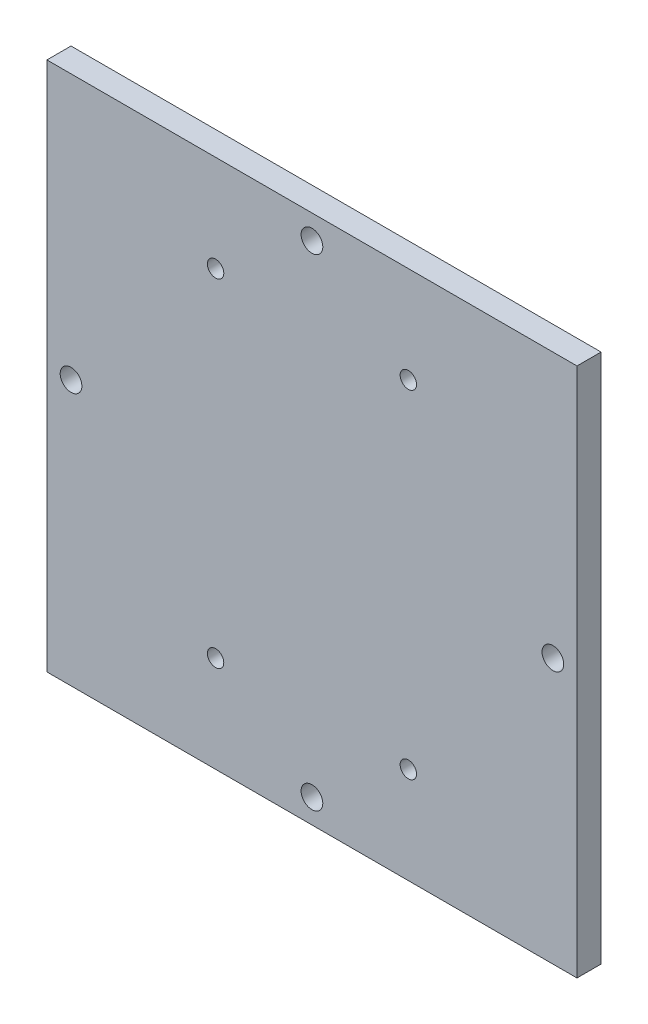
ISO-10303-21;
HEADER;
FILE_DESCRIPTION(('STEP AP214'),'2;1');
FILE_NAME('part.step','',(''),(''),'','','');
FILE_SCHEMA(('AUTOMOTIVE_DESIGN { 1 0 10303 214 1 1 1 1 }'));
ENDSEC;
DATA;
#1=APPLICATION_CONTEXT('core data for automotive mechanical design processes');
#2=APPLICATION_PROTOCOL_DEFINITION('international standard','automotive_design',2000,#1);
#3=PRODUCT_CONTEXT('',#1,'mechanical');
#4=PRODUCT('Part','Part','',(#3));
#5=PRODUCT_RELATED_PRODUCT_CATEGORY('part','',(#4));
#6=PRODUCT_DEFINITION_FORMATION('','',#4);
#7=PRODUCT_DEFINITION_CONTEXT('part definition',#1,'design');
#8=PRODUCT_DEFINITION('design','',#6,#7);
#9=PRODUCT_DEFINITION_SHAPE('','',#8);
#10=(LENGTH_UNIT() NAMED_UNIT(*) SI_UNIT(.MILLI.,.METRE.));
#11=(NAMED_UNIT(*) PLANE_ANGLE_UNIT() SI_UNIT($,.RADIAN.));
#12=(NAMED_UNIT(*) SI_UNIT($,.STERADIAN.) SOLID_ANGLE_UNIT());
#13=UNCERTAINTY_MEASURE_WITH_UNIT(LENGTH_MEASURE(1.E-05),#10,'distance_accuracy_value','');
#14=(GEOMETRIC_REPRESENTATION_CONTEXT(3) GLOBAL_UNCERTAINTY_ASSIGNED_CONTEXT((#13)) GLOBAL_UNIT_ASSIGNED_CONTEXT((#10,
#11,#12)) REPRESENTATION_CONTEXT('',''));
#15=CARTESIAN_POINT('',(0.,0.,0.));
#16=DIRECTION('',(0.,0.,1.));
#17=DIRECTION('',(1.,0.,0.));
#18=AXIS2_PLACEMENT_3D('',#15,#16,#17);
#19=CARTESIAN_POINT('',(110.,-110.,10.));
#20=DIRECTION('',(-1.,0.,0.));
#21=DIRECTION('',(0.,0.,1.));
#22=AXIS2_PLACEMENT_3D('',#19,#20,#21);
#23=PLANE('',#22);
#24=DIRECTION('',(0.,1.,0.));
#25=VECTOR('',#24,1.);
#26=CARTESIAN_POINT('',(110.,-110.,0.));
#27=LINE('',#26,#25);
#28=CARTESIAN_POINT('',(110.,-110.,0.));
#29=VERTEX_POINT('',#28);
#30=CARTESIAN_POINT('',(110.,110.,0.));
#31=VERTEX_POINT('',#30);
#32=EDGE_CURVE('E101',#29,#31,#27,.T.);
#33=ORIENTED_EDGE('',*,*,#32,.T.);
#34=DIRECTION('',(0.,0.,-1.));
#35=VECTOR('',#34,1.);
#36=CARTESIAN_POINT('',(110.,110.,10.));
#37=LINE('',#36,#35);
#38=CARTESIAN_POINT('',(110.,110.,10.));
#39=VERTEX_POINT('',#38);
#40=EDGE_CURVE('E11',#39,#31,#37,.T.);
#41=ORIENTED_EDGE('',*,*,#40,.F.);
#42=DIRECTION('',(0.,1.,0.));
#43=VECTOR('',#42,1.);
#44=CARTESIAN_POINT('',(110.,-110.,10.));
#45=LINE('',#44,#43);
#46=CARTESIAN_POINT('',(110.,-110.,10.));
#47=VERTEX_POINT('',#46);
#48=EDGE_CURVE('E89',#47,#39,#45,.T.);
#49=ORIENTED_EDGE('',*,*,#48,.F.);
#50=DIRECTION('',(0.,0.,-1.));
#51=VECTOR('',#50,1.);
#52=CARTESIAN_POINT('',(110.,-110.,10.));
#53=LINE('',#52,#51);
#54=EDGE_CURVE('E97',#47,#29,#53,.T.);
#55=ORIENTED_EDGE('',*,*,#54,.T.);
#56=EDGE_LOOP('',(#33,#41,#49,#55));
#57=FACE_BOUND('',#56,.T.);
#58=ADVANCED_FACE('F38',(#57),#23,.F.);
#59=CARTESIAN_POINT('',(-110.,110.,10.));
#60=DIRECTION('',(0.,-1.,0.));
#61=DIRECTION('',(0.,0.,-1.));
#62=AXIS2_PLACEMENT_3D('',#59,#60,#61);
#63=PLANE('',#62);
#64=DIRECTION('',(-1.,0.,0.));
#65=VECTOR('',#64,1.);
#66=CARTESIAN_POINT('',(-110.,110.,0.));
#67=LINE('',#66,#65);
#68=CARTESIAN_POINT('',(-110.,110.,0.));
#69=VERTEX_POINT('',#68);
#70=EDGE_CURVE('E93',#31,#69,#67,.T.);
#71=ORIENTED_EDGE('',*,*,#70,.T.);
#72=DIRECTION('',(0.,0.,-1.));
#73=VECTOR('',#72,1.);
#74=CARTESIAN_POINT('',(-110.,110.,10.));
#75=LINE('',#74,#73);
#76=CARTESIAN_POINT('',(-110.,110.,10.));
#77=VERTEX_POINT('',#76);
#78=EDGE_CURVE('E46',#77,#69,#75,.T.);
#79=ORIENTED_EDGE('',*,*,#78,.F.);
#80=DIRECTION('',(-1.,0.,0.));
#81=VECTOR('',#80,1.);
#82=CARTESIAN_POINT('',(-110.,110.,10.));
#83=LINE('',#82,#81);
#84=EDGE_CURVE('E84',#39,#77,#83,.T.);
#85=ORIENTED_EDGE('',*,*,#84,.F.);
#86=ORIENTED_EDGE('',*,*,#40,.T.);
#87=EDGE_LOOP('',(#71,#79,#85,#86));
#88=FACE_BOUND('',#87,.T.);
#89=ADVANCED_FACE('F92',(#88),#63,.F.);
#90=CARTESIAN_POINT('',(-110.,-110.,10.));
#91=DIRECTION('',(1.,0.,0.));
#92=DIRECTION('',(0.,0.,-1.));
#93=AXIS2_PLACEMENT_3D('',#90,#91,#92);
#94=PLANE('',#93);
#95=DIRECTION('',(0.,-1.,0.));
#96=VECTOR('',#95,1.);
#97=CARTESIAN_POINT('',(-110.,-110.,0.));
#98=LINE('',#97,#96);
#99=CARTESIAN_POINT('',(-110.,-110.,0.));
#100=VERTEX_POINT('',#99);
#101=EDGE_CURVE('E71',#69,#100,#98,.T.);
#102=ORIENTED_EDGE('',*,*,#101,.T.);
#103=DIRECTION('',(0.,0.,-1.));
#104=VECTOR('',#103,1.);
#105=CARTESIAN_POINT('',(-110.,-110.,10.));
#106=LINE('',#105,#104);
#107=CARTESIAN_POINT('',(-110.,-110.,10.));
#108=VERTEX_POINT('',#107);
#109=EDGE_CURVE('E94',#108,#100,#106,.T.);
#110=ORIENTED_EDGE('',*,*,#109,.F.);
#111=DIRECTION('',(0.,-1.,0.));
#112=VECTOR('',#111,1.);
#113=CARTESIAN_POINT('',(-110.,-110.,10.));
#114=LINE('',#113,#112);
#115=EDGE_CURVE('E87',#77,#108,#114,.T.);
#116=ORIENTED_EDGE('',*,*,#115,.F.);
#117=ORIENTED_EDGE('',*,*,#78,.T.);
#118=EDGE_LOOP('',(#102,#110,#116,#117));
#119=FACE_BOUND('',#118,.T.);
#120=ADVANCED_FACE('F95',(#119),#94,.F.);
#121=CARTESIAN_POINT('',(-110.,-110.,10.));
#122=DIRECTION('',(0.,1.,0.));
#123=DIRECTION('',(0.,0.,1.));
#124=AXIS2_PLACEMENT_3D('',#121,#122,#123);
#125=PLANE('',#124);
#126=DIRECTION('',(1.,0.,0.));
#127=VECTOR('',#126,1.);
#128=CARTESIAN_POINT('',(-110.,-110.,0.));
#129=LINE('',#128,#127);
#130=EDGE_CURVE('E77',#100,#29,#129,.T.);
#131=ORIENTED_EDGE('',*,*,#130,.T.);
#132=ORIENTED_EDGE('',*,*,#54,.F.);
#133=DIRECTION('',(1.,0.,0.));
#134=VECTOR('',#133,1.);
#135=CARTESIAN_POINT('',(-110.,-110.,10.));
#136=LINE('',#135,#134);
#137=EDGE_CURVE('E54',#108,#47,#136,.T.);
#138=ORIENTED_EDGE('',*,*,#137,.F.);
#139=ORIENTED_EDGE('',*,*,#109,.T.);
#140=EDGE_LOOP('',(#131,#132,#138,#139));
#141=FACE_BOUND('',#140,.T.);
#142=ADVANCED_FACE('F109',(#141),#125,.F.);
#143=CARTESIAN_POINT('',(0.,0.,10.));
#144=DIRECTION('',(0.,0.,-1.));
#145=DIRECTION('',(-1.,0.,0.));
#146=AXIS2_PLACEMENT_3D('',#143,#144,#145);
#147=PLANE('',#146);
#148=CARTESIAN_POINT('',(-40.,-70.,10.));
#149=DIRECTION('',(0.,0.,1.));
#150=DIRECTION('',(1.,0.,0.));
#151=AXIS2_PLACEMENT_3D('',#148,#149,#150);
#152=CIRCLE('',#151,3.4);
#153=CARTESIAN_POINT('',(-36.6,-70.,10.));
#154=VERTEX_POINT('',#153);
#155=EDGE_CURVE('E145',#154,#154,#152,.T.);
#156=ORIENTED_EDGE('',*,*,#155,.F.);
#157=EDGE_LOOP('',(#156));
#158=FACE_BOUND('',#157,.T.);
#159=CARTESIAN_POINT('',(40.,-70.,10.));
#160=DIRECTION('',(0.,0.,1.));
#161=DIRECTION('',(-1.,0.,0.));
#162=AXIS2_PLACEMENT_3D('',#159,#160,#161);
#163=CIRCLE('',#162,3.4);
#164=CARTESIAN_POINT('',(36.6,-70.,10.));
#165=VERTEX_POINT('',#164);
#166=EDGE_CURVE('E151',#165,#165,#163,.T.);
#167=ORIENTED_EDGE('',*,*,#166,.F.);
#168=EDGE_LOOP('',(#167));
#169=FACE_BOUND('',#168,.T.);
#170=CARTESIAN_POINT('',(40.,70.,10.));
#171=DIRECTION('',(0.,0.,1.));
#172=DIRECTION('',(1.,0.,0.));
#173=AXIS2_PLACEMENT_3D('',#170,#171,#172);
#174=CIRCLE('',#173,3.4);
#175=CARTESIAN_POINT('',(43.4,70.,10.));
#176=VERTEX_POINT('',#175);
#177=EDGE_CURVE('E157',#176,#176,#174,.T.);
#178=ORIENTED_EDGE('',*,*,#177,.F.);
#179=EDGE_LOOP('',(#178));
#180=FACE_BOUND('',#179,.T.);
#181=CARTESIAN_POINT('',(-40.,70.,10.));
#182=DIRECTION('',(0.,0.,1.));
#183=DIRECTION('',(-1.,0.,0.));
#184=AXIS2_PLACEMENT_3D('',#181,#182,#183);
#185=CIRCLE('',#184,3.4);
#186=CARTESIAN_POINT('',(-43.4,70.,10.));
#187=VERTEX_POINT('',#186);
#188=EDGE_CURVE('E139',#187,#187,#185,.T.);
#189=ORIENTED_EDGE('',*,*,#188,.F.);
#190=EDGE_LOOP('',(#189));
#191=FACE_BOUND('',#190,.T.);
#192=CARTESIAN_POINT('',(100.,0.,10.));
#193=DIRECTION('',(0.,0.,1.));
#194=DIRECTION('',(1.,0.,0.));
#195=AXIS2_PLACEMENT_3D('',#192,#193,#194);
#196=CIRCLE('',#195,4.5);
#197=CARTESIAN_POINT('',(104.5,0.,10.));
#198=VERTEX_POINT('',#197);
#199=EDGE_CURVE('E134',#198,#198,#196,.T.);
#200=ORIENTED_EDGE('',*,*,#199,.F.);
#201=EDGE_LOOP('',(#200));
#202=FACE_BOUND('',#201,.T.);
#203=CARTESIAN_POINT('',(0.,-100.,10.));
#204=DIRECTION('',(0.,0.,1.));
#205=DIRECTION('',(1.,0.,0.));
#206=AXIS2_PLACEMENT_3D('',#203,#204,#205);
#207=CIRCLE('',#206,4.5);
#208=CARTESIAN_POINT('',(4.50000000000001,-100.,10.));
#209=VERTEX_POINT('',#208);
#210=EDGE_CURVE('E128',#209,#209,#207,.T.);
#211=ORIENTED_EDGE('',*,*,#210,.F.);
#212=EDGE_LOOP('',(#211));
#213=FACE_BOUND('',#212,.T.);
#214=CARTESIAN_POINT('',(-100.,0.,10.));
#215=DIRECTION('',(0.,0.,1.));
#216=DIRECTION('',(1.,0.,0.));
#217=AXIS2_PLACEMENT_3D('',#214,#215,#216);
#218=CIRCLE('',#217,4.5);
#219=CARTESIAN_POINT('',(-95.5,0.,10.));
#220=VERTEX_POINT('',#219);
#221=EDGE_CURVE('E122',#220,#220,#218,.T.);
#222=ORIENTED_EDGE('',*,*,#221,.F.);
#223=EDGE_LOOP('',(#222));
#224=FACE_BOUND('',#223,.T.);
#225=CARTESIAN_POINT('',(0.,100.,10.));
#226=DIRECTION('',(0.,0.,1.));
#227=DIRECTION('',(1.,0.,0.));
#228=AXIS2_PLACEMENT_3D('',#225,#226,#227);
#229=CIRCLE('',#228,4.50000000000001);
#230=CARTESIAN_POINT('',(4.49999999999999,100.,10.));
#231=VERTEX_POINT('',#230);
#232=EDGE_CURVE('E115',#231,#231,#229,.T.);
#233=ORIENTED_EDGE('',*,*,#232,.F.);
#234=EDGE_LOOP('',(#233));
#235=FACE_BOUND('',#234,.T.);
#236=ORIENTED_EDGE('',*,*,#48,.T.);
#237=ORIENTED_EDGE('',*,*,#84,.T.);
#238=ORIENTED_EDGE('',*,*,#115,.T.);
#239=ORIENTED_EDGE('',*,*,#137,.T.);
#240=EDGE_LOOP('',(#236,#237,#238,#239));
#241=FACE_BOUND('',#240,.T.);
#242=ADVANCED_FACE('F85',(#158,#169,#180,#191,#202,#213,#224,#235,#241),#147,.F.);
#243=CARTESIAN_POINT('',(0.,0.,0.));
#244=DIRECTION('',(0.,0.,-1.));
#245=DIRECTION('',(-1.,0.,0.));
#246=AXIS2_PLACEMENT_3D('',#243,#244,#245);
#247=PLANE('',#246);
#248=CARTESIAN_POINT('',(-40.,-70.,0.));
#249=DIRECTION('',(0.,0.,1.));
#250=DIRECTION('',(1.,0.,0.));
#251=AXIS2_PLACEMENT_3D('',#248,#249,#250);
#252=CIRCLE('',#251,3.4);
#253=CARTESIAN_POINT('',(-36.6,-70.,0.));
#254=VERTEX_POINT('',#253);
#255=EDGE_CURVE('E148',#254,#254,#252,.T.);
#256=ORIENTED_EDGE('',*,*,#255,.T.);
#257=EDGE_LOOP('',(#256));
#258=FACE_BOUND('',#257,.T.);
#259=CARTESIAN_POINT('',(40.,-70.,0.));
#260=DIRECTION('',(0.,0.,1.));
#261=DIRECTION('',(-1.,0.,0.));
#262=AXIS2_PLACEMENT_3D('',#259,#260,#261);
#263=CIRCLE('',#262,3.4);
#264=CARTESIAN_POINT('',(36.6,-70.,0.));
#265=VERTEX_POINT('',#264);
#266=EDGE_CURVE('E154',#265,#265,#263,.T.);
#267=ORIENTED_EDGE('',*,*,#266,.T.);
#268=EDGE_LOOP('',(#267));
#269=FACE_BOUND('',#268,.T.);
#270=CARTESIAN_POINT('',(40.,70.,0.));
#271=DIRECTION('',(0.,0.,1.));
#272=DIRECTION('',(1.,0.,0.));
#273=AXIS2_PLACEMENT_3D('',#270,#271,#272);
#274=CIRCLE('',#273,3.4);
#275=CARTESIAN_POINT('',(43.4,70.,0.));
#276=VERTEX_POINT('',#275);
#277=EDGE_CURVE('E142',#276,#276,#274,.T.);
#278=ORIENTED_EDGE('',*,*,#277,.T.);
#279=EDGE_LOOP('',(#278));
#280=FACE_BOUND('',#279,.T.);
#281=CARTESIAN_POINT('',(-40.,70.,0.));
#282=DIRECTION('',(0.,0.,1.));
#283=DIRECTION('',(-1.,0.,0.));
#284=AXIS2_PLACEMENT_3D('',#281,#282,#283);
#285=CIRCLE('',#284,3.4);
#286=CARTESIAN_POINT('',(-43.4,70.,0.));
#287=VERTEX_POINT('',#286);
#288=EDGE_CURVE('E119',#287,#287,#285,.T.);
#289=ORIENTED_EDGE('',*,*,#288,.T.);
#290=EDGE_LOOP('',(#289));
#291=FACE_BOUND('',#290,.T.);
#292=CARTESIAN_POINT('',(100.,0.,0.));
#293=DIRECTION('',(0.,0.,1.));
#294=DIRECTION('',(1.,0.,0.));
#295=AXIS2_PLACEMENT_3D('',#292,#293,#294);
#296=CIRCLE('',#295,4.5);
#297=CARTESIAN_POINT('',(104.5,0.,0.));
#298=VERTEX_POINT('',#297);
#299=EDGE_CURVE('E104',#298,#298,#296,.T.);
#300=ORIENTED_EDGE('',*,*,#299,.T.);
#301=EDGE_LOOP('',(#300));
#302=FACE_BOUND('',#301,.T.);
#303=CARTESIAN_POINT('',(0.,-100.,0.));
#304=DIRECTION('',(0.,0.,1.));
#305=DIRECTION('',(1.,0.,0.));
#306=AXIS2_PLACEMENT_3D('',#303,#304,#305);
#307=CIRCLE('',#306,4.5);
#308=CARTESIAN_POINT('',(4.50000000000001,-100.,0.));
#309=VERTEX_POINT('',#308);
#310=EDGE_CURVE('E131',#309,#309,#307,.T.);
#311=ORIENTED_EDGE('',*,*,#310,.T.);
#312=EDGE_LOOP('',(#311));
#313=FACE_BOUND('',#312,.T.);
#314=CARTESIAN_POINT('',(-100.,0.,0.));
#315=DIRECTION('',(0.,0.,1.));
#316=DIRECTION('',(1.,0.,0.));
#317=AXIS2_PLACEMENT_3D('',#314,#315,#316);
#318=CIRCLE('',#317,4.5);
#319=CARTESIAN_POINT('',(-95.5,0.,0.));
#320=VERTEX_POINT('',#319);
#321=EDGE_CURVE('E125',#320,#320,#318,.T.);
#322=ORIENTED_EDGE('',*,*,#321,.T.);
#323=EDGE_LOOP('',(#322));
#324=FACE_BOUND('',#323,.T.);
#325=CARTESIAN_POINT('',(0.,100.,0.));
#326=DIRECTION('',(0.,0.,1.));
#327=DIRECTION('',(1.,0.,0.));
#328=AXIS2_PLACEMENT_3D('',#325,#326,#327);
#329=CIRCLE('',#328,4.50000000000001);
#330=CARTESIAN_POINT('',(4.49999999999999,100.,0.));
#331=VERTEX_POINT('',#330);
#332=EDGE_CURVE('E118',#331,#331,#329,.T.);
#333=ORIENTED_EDGE('',*,*,#332,.T.);
#334=EDGE_LOOP('',(#333));
#335=FACE_BOUND('',#334,.T.);
#336=ORIENTED_EDGE('',*,*,#32,.F.);
#337=ORIENTED_EDGE('',*,*,#130,.F.);
#338=ORIENTED_EDGE('',*,*,#101,.F.);
#339=ORIENTED_EDGE('',*,*,#70,.F.);
#340=EDGE_LOOP('',(#336,#337,#338,#339));
#341=FACE_BOUND('',#340,.T.);
#342=ADVANCED_FACE('F112',(#258,#269,#280,#291,#302,#313,#324,#335,#341),#247,.T.);
#343=CARTESIAN_POINT('',(0.,100.,0.));
#344=DIRECTION('',(0.,0.,1.));
#345=DIRECTION('',(1.,0.,0.));
#346=AXIS2_PLACEMENT_3D('',#343,#344,#345);
#347=CYLINDRICAL_SURFACE('',#346,4.50000000000001);
#348=ORIENTED_EDGE('',*,*,#332,.F.);
#349=EDGE_LOOP('',(#348));
#350=FACE_BOUND('',#349,.T.);
#351=ORIENTED_EDGE('',*,*,#232,.T.);
#352=EDGE_LOOP('',(#351));
#353=FACE_BOUND('',#352,.T.);
#354=ADVANCED_FACE('F187',(#350,#353),#347,.F.);
#355=CARTESIAN_POINT('',(-100.,0.,0.));
#356=DIRECTION('',(0.,0.,1.));
#357=DIRECTION('',(1.,0.,0.));
#358=AXIS2_PLACEMENT_3D('',#355,#356,#357);
#359=CYLINDRICAL_SURFACE('',#358,4.5);
#360=ORIENTED_EDGE('',*,*,#321,.F.);
#361=EDGE_LOOP('',(#360));
#362=FACE_BOUND('',#361,.T.);
#363=ORIENTED_EDGE('',*,*,#221,.T.);
#364=EDGE_LOOP('',(#363));
#365=FACE_BOUND('',#364,.T.);
#366=ADVANCED_FACE('F189',(#362,#365),#359,.F.);
#367=CARTESIAN_POINT('',(0.,-100.,0.));
#368=DIRECTION('',(0.,0.,1.));
#369=DIRECTION('',(1.,0.,0.));
#370=AXIS2_PLACEMENT_3D('',#367,#368,#369);
#371=CYLINDRICAL_SURFACE('',#370,4.5);
#372=ORIENTED_EDGE('',*,*,#310,.F.);
#373=EDGE_LOOP('',(#372));
#374=FACE_BOUND('',#373,.T.);
#375=ORIENTED_EDGE('',*,*,#210,.T.);
#376=EDGE_LOOP('',(#375));
#377=FACE_BOUND('',#376,.T.);
#378=ADVANCED_FACE('F196',(#374,#377),#371,.F.);
#379=CARTESIAN_POINT('',(100.,0.,0.));
#380=DIRECTION('',(0.,0.,1.));
#381=DIRECTION('',(1.,0.,0.));
#382=AXIS2_PLACEMENT_3D('',#379,#380,#381);
#383=CYLINDRICAL_SURFACE('',#382,4.5);
#384=ORIENTED_EDGE('',*,*,#299,.F.);
#385=EDGE_LOOP('',(#384));
#386=FACE_BOUND('',#385,.T.);
#387=ORIENTED_EDGE('',*,*,#199,.T.);
#388=EDGE_LOOP('',(#387));
#389=FACE_BOUND('',#388,.T.);
#390=ADVANCED_FACE('F237',(#386,#389),#383,.F.);
#391=CARTESIAN_POINT('',(-40.,70.,0.));
#392=DIRECTION('',(0.,0.,1.));
#393=DIRECTION('',(1.,0.,0.));
#394=AXIS2_PLACEMENT_3D('',#391,#392,#393);
#395=CYLINDRICAL_SURFACE('',#394,3.4);
#396=ORIENTED_EDGE('',*,*,#288,.F.);
#397=EDGE_LOOP('',(#396));
#398=FACE_BOUND('',#397,.T.);
#399=ORIENTED_EDGE('',*,*,#188,.T.);
#400=EDGE_LOOP('',(#399));
#401=FACE_BOUND('',#400,.T.);
#402=ADVANCED_FACE('F169',(#398,#401),#395,.F.);
#403=CARTESIAN_POINT('',(40.,70.,0.));
#404=DIRECTION('',(0.,0.,1.));
#405=DIRECTION('',(1.,0.,0.));
#406=AXIS2_PLACEMENT_3D('',#403,#404,#405);
#407=CYLINDRICAL_SURFACE('',#406,3.4);
#408=ORIENTED_EDGE('',*,*,#277,.F.);
#409=EDGE_LOOP('',(#408));
#410=FACE_BOUND('',#409,.T.);
#411=ORIENTED_EDGE('',*,*,#177,.T.);
#412=EDGE_LOOP('',(#411));
#413=FACE_BOUND('',#412,.T.);
#414=ADVANCED_FACE('F165',(#410,#413),#407,.F.);
#415=CARTESIAN_POINT('',(40.,-70.,0.));
#416=DIRECTION('',(0.,0.,1.));
#417=DIRECTION('',(1.,0.,0.));
#418=AXIS2_PLACEMENT_3D('',#415,#416,#417);
#419=CYLINDRICAL_SURFACE('',#418,3.4);
#420=ORIENTED_EDGE('',*,*,#266,.F.);
#421=EDGE_LOOP('',(#420));
#422=FACE_BOUND('',#421,.T.);
#423=ORIENTED_EDGE('',*,*,#166,.T.);
#424=EDGE_LOOP('',(#423));
#425=FACE_BOUND('',#424,.T.);
#426=ADVANCED_FACE('F168',(#422,#425),#419,.F.);
#427=CARTESIAN_POINT('',(-40.,-70.,0.));
#428=DIRECTION('',(0.,0.,1.));
#429=DIRECTION('',(1.,0.,0.));
#430=AXIS2_PLACEMENT_3D('',#427,#428,#429);
#431=CYLINDRICAL_SURFACE('',#430,3.4);
#432=ORIENTED_EDGE('',*,*,#255,.F.);
#433=EDGE_LOOP('',(#432));
#434=FACE_BOUND('',#433,.T.);
#435=ORIENTED_EDGE('',*,*,#155,.T.);
#436=EDGE_LOOP('',(#435));
#437=FACE_BOUND('',#436,.T.);
#438=ADVANCED_FACE('F255',(#434,#437),#431,.F.);
#439=CLOSED_SHELL('',(#58,#89,#120,#142,#242,#342,#354,#366,#378,#390,#402,#414,#426,#438));
#440=MANIFOLD_SOLID_BREP('B2',#439);
#441=ADVANCED_BREP_SHAPE_REPRESENTATION('',(#18,#440),#14);
#442=SHAPE_DEFINITION_REPRESENTATION(#9,#441);
ENDSEC;
END-ISO-10303-21;
